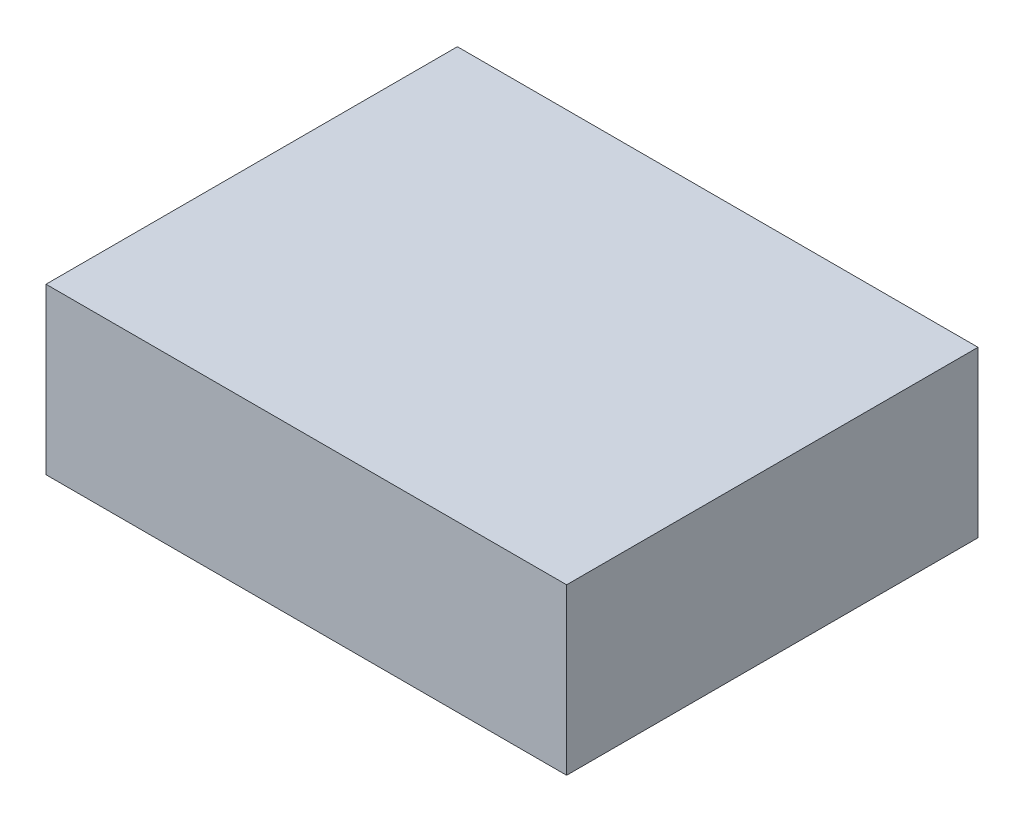
ISO-10303-21;
HEADER;
FILE_DESCRIPTION(('STEP AP214'),'2;1');
FILE_NAME('part.step','',(''),(''),'','','');
FILE_SCHEMA(('AUTOMOTIVE_DESIGN { 1 0 10303 214 1 1 1 1 }'));
ENDSEC;
DATA;
#1=APPLICATION_CONTEXT('core data for automotive mechanical design processes');
#2=APPLICATION_PROTOCOL_DEFINITION('international standard','automotive_design',2000,#1);
#3=PRODUCT_CONTEXT('',#1,'mechanical');
#4=PRODUCT('Part','Part','',(#3));
#5=PRODUCT_RELATED_PRODUCT_CATEGORY('part','',(#4));
#6=PRODUCT_DEFINITION_FORMATION('','',#4);
#7=PRODUCT_DEFINITION_CONTEXT('part definition',#1,'design');
#8=PRODUCT_DEFINITION('design','',#6,#7);
#9=PRODUCT_DEFINITION_SHAPE('','',#8);
#10=(LENGTH_UNIT() NAMED_UNIT(*) SI_UNIT(.MILLI.,.METRE.));
#11=(NAMED_UNIT(*) PLANE_ANGLE_UNIT() SI_UNIT($,.RADIAN.));
#12=(NAMED_UNIT(*) SI_UNIT($,.STERADIAN.) SOLID_ANGLE_UNIT());
#13=UNCERTAINTY_MEASURE_WITH_UNIT(LENGTH_MEASURE(1.E-05),#10,'distance_accuracy_value','');
#14=(GEOMETRIC_REPRESENTATION_CONTEXT(3) GLOBAL_UNCERTAINTY_ASSIGNED_CONTEXT((#13)) GLOBAL_UNIT_ASSIGNED_CONTEXT((#10,
#11,#12)) REPRESENTATION_CONTEXT('',''));
#15=CARTESIAN_POINT('',(0.,0.,0.));
#16=DIRECTION('',(0.,0.,1.));
#17=DIRECTION('',(1.,0.,0.));
#18=AXIS2_PLACEMENT_3D('',#15,#16,#17);
#19=CARTESIAN_POINT('',(-20.3017236594292,10.,-5.54830057876643));
#20=DIRECTION('',(1.,0.,0.));
#21=DIRECTION('',(0.,0.,-1.));
#22=AXIS2_PLACEMENT_3D('',#19,#20,#21);
#23=PLANE('',#22);
#24=DIRECTION('',(0.,0.,1.));
#25=VECTOR('',#24,1.);
#26=CARTESIAN_POINT('',(-20.3017236594292,0.,-5.54830057876643));
#27=LINE('',#26,#25);
#28=CARTESIAN_POINT('',(-20.3017236594292,0.,-5.54830057876643));
#29=VERTEX_POINT('',#28);
#30=CARTESIAN_POINT('',(-20.3017236594292,0.,19.3863795404354));
#31=VERTEX_POINT('',#30);
#32=EDGE_CURVE('E96',#29,#31,#27,.T.);
#33=ORIENTED_EDGE('',*,*,#32,.T.);
#34=DIRECTION('',(0.,-1.,0.));
#35=VECTOR('',#34,1.);
#36=CARTESIAN_POINT('',(-20.3017236594292,10.,19.3863795404354));
#37=LINE('',#36,#35);
#38=CARTESIAN_POINT('',(-20.3017236594292,10.,19.3863795404354));
#39=VERTEX_POINT('',#38);
#40=EDGE_CURVE('E11',#39,#31,#37,.T.);
#41=ORIENTED_EDGE('',*,*,#40,.F.);
#42=DIRECTION('',(0.,0.,1.));
#43=VECTOR('',#42,1.);
#44=CARTESIAN_POINT('',(-20.3017236594292,10.,-5.54830057876643));
#45=LINE('',#44,#43);
#46=CARTESIAN_POINT('',(-20.3017236594292,10.,-5.54830057876643));
#47=VERTEX_POINT('',#46);
#48=EDGE_CURVE('E84',#47,#39,#45,.T.);
#49=ORIENTED_EDGE('',*,*,#48,.F.);
#50=DIRECTION('',(0.,-1.,0.));
#51=VECTOR('',#50,1.);
#52=CARTESIAN_POINT('',(-20.3017236594292,10.,-5.54830057876643));
#53=LINE('',#52,#51);
#54=EDGE_CURVE('E92',#47,#29,#53,.T.);
#55=ORIENTED_EDGE('',*,*,#54,.T.);
#56=EDGE_LOOP('',(#33,#41,#49,#55));
#57=FACE_BOUND('',#56,.T.);
#58=ADVANCED_FACE('F33',(#57),#23,.F.);
#59=CARTESIAN_POINT('',(-20.3017236594292,10.,19.3863795404354));
#60=DIRECTION('',(0.,0.,-1.));
#61=DIRECTION('',(-1.,0.,0.));
#62=AXIS2_PLACEMENT_3D('',#59,#60,#61);
#63=PLANE('',#62);
#64=DIRECTION('',(1.,0.,0.));
#65=VECTOR('',#64,1.);
#66=CARTESIAN_POINT('',(-20.3017236594292,0.,19.3863795404354));
#67=LINE('',#66,#65);
#68=CARTESIAN_POINT('',(11.2538586194546,0.,19.3863795404354));
#69=VERTEX_POINT('',#68);
#70=EDGE_CURVE('E88',#31,#69,#67,.T.);
#71=ORIENTED_EDGE('',*,*,#70,.T.);
#72=DIRECTION('',(0.,-1.,0.));
#73=VECTOR('',#72,1.);
#74=CARTESIAN_POINT('',(11.2538586194546,10.,19.3863795404354));
#75=LINE('',#74,#73);
#76=CARTESIAN_POINT('',(11.2538586194546,10.,19.3863795404354));
#77=VERTEX_POINT('',#76);
#78=EDGE_CURVE('E41',#77,#69,#75,.T.);
#79=ORIENTED_EDGE('',*,*,#78,.F.);
#80=DIRECTION('',(1.,0.,0.));
#81=VECTOR('',#80,1.);
#82=CARTESIAN_POINT('',(-20.3017236594292,10.,19.3863795404354));
#83=LINE('',#82,#81);
#84=EDGE_CURVE('E79',#39,#77,#83,.T.);
#85=ORIENTED_EDGE('',*,*,#84,.F.);
#86=ORIENTED_EDGE('',*,*,#40,.T.);
#87=EDGE_LOOP('',(#71,#79,#85,#86));
#88=FACE_BOUND('',#87,.T.);
#89=ADVANCED_FACE('F87',(#88),#63,.F.);
#90=CARTESIAN_POINT('',(11.2538586194546,10.,-5.54830057876643));
#91=DIRECTION('',(-1.,0.,0.));
#92=DIRECTION('',(0.,0.,1.));
#93=AXIS2_PLACEMENT_3D('',#90,#91,#92);
#94=PLANE('',#93);
#95=DIRECTION('',(0.,0.,-1.));
#96=VECTOR('',#95,1.);
#97=CARTESIAN_POINT('',(11.2538586194546,0.,-5.54830057876643));
#98=LINE('',#97,#96);
#99=CARTESIAN_POINT('',(11.2538586194546,0.,-5.54830057876643));
#100=VERTEX_POINT('',#99);
#101=EDGE_CURVE('E66',#69,#100,#98,.T.);
#102=ORIENTED_EDGE('',*,*,#101,.T.);
#103=DIRECTION('',(0.,-1.,0.));
#104=VECTOR('',#103,1.);
#105=CARTESIAN_POINT('',(11.2538586194546,10.,-5.54830057876643));
#106=LINE('',#105,#104);
#107=CARTESIAN_POINT('',(11.2538586194546,10.,-5.54830057876643));
#108=VERTEX_POINT('',#107);
#109=EDGE_CURVE('E89',#108,#100,#106,.T.);
#110=ORIENTED_EDGE('',*,*,#109,.F.);
#111=DIRECTION('',(0.,0.,-1.));
#112=VECTOR('',#111,1.);
#113=CARTESIAN_POINT('',(11.2538586194546,10.,-5.54830057876643));
#114=LINE('',#113,#112);
#115=EDGE_CURVE('E82',#77,#108,#114,.T.);
#116=ORIENTED_EDGE('',*,*,#115,.F.);
#117=ORIENTED_EDGE('',*,*,#78,.T.);
#118=EDGE_LOOP('',(#102,#110,#116,#117));
#119=FACE_BOUND('',#118,.T.);
#120=ADVANCED_FACE('F90',(#119),#94,.F.);
#121=CARTESIAN_POINT('',(-20.3017236594292,10.,-5.54830057876643));
#122=DIRECTION('',(0.,0.,1.));
#123=DIRECTION('',(1.,0.,0.));
#124=AXIS2_PLACEMENT_3D('',#121,#122,#123);
#125=PLANE('',#124);
#126=DIRECTION('',(-1.,0.,0.));
#127=VECTOR('',#126,1.);
#128=CARTESIAN_POINT('',(-20.3017236594292,0.,-5.54830057876643));
#129=LINE('',#128,#127);
#130=EDGE_CURVE('E72',#100,#29,#129,.T.);
#131=ORIENTED_EDGE('',*,*,#130,.T.);
#132=ORIENTED_EDGE('',*,*,#54,.F.);
#133=DIRECTION('',(-1.,0.,0.));
#134=VECTOR('',#133,1.);
#135=CARTESIAN_POINT('',(-20.3017236594292,10.,-5.54830057876643));
#136=LINE('',#135,#134);
#137=EDGE_CURVE('E49',#108,#47,#136,.T.);
#138=ORIENTED_EDGE('',*,*,#137,.F.);
#139=ORIENTED_EDGE('',*,*,#109,.T.);
#140=EDGE_LOOP('',(#131,#132,#138,#139));
#141=FACE_BOUND('',#140,.T.);
#142=ADVANCED_FACE('F103',(#141),#125,.F.);
#143=CARTESIAN_POINT('',(0.,10.,0.));
#144=DIRECTION('',(0.,1.,0.));
#145=DIRECTION('',(0.,0.,1.));
#146=AXIS2_PLACEMENT_3D('',#143,#144,#145);
#147=PLANE('',#146);
#148=ORIENTED_EDGE('',*,*,#48,.T.);
#149=ORIENTED_EDGE('',*,*,#84,.T.);
#150=ORIENTED_EDGE('',*,*,#115,.T.);
#151=ORIENTED_EDGE('',*,*,#137,.T.);
#152=EDGE_LOOP('',(#148,#149,#150,#151));
#153=FACE_BOUND('',#152,.T.);
#154=ADVANCED_FACE('F80',(#153),#147,.T.);
#155=CARTESIAN_POINT('',(0.,0.,0.));
#156=DIRECTION('',(0.,1.,0.));
#157=DIRECTION('',(0.,0.,1.));
#158=AXIS2_PLACEMENT_3D('',#155,#156,#157);
#159=PLANE('',#158);
#160=ORIENTED_EDGE('',*,*,#32,.F.);
#161=ORIENTED_EDGE('',*,*,#130,.F.);
#162=ORIENTED_EDGE('',*,*,#101,.F.);
#163=ORIENTED_EDGE('',*,*,#70,.F.);
#164=EDGE_LOOP('',(#160,#161,#162,#163));
#165=FACE_BOUND('',#164,.T.);
#166=ADVANCED_FACE('F106',(#165),#159,.F.);
#167=CLOSED_SHELL('',(#58,#89,#120,#142,#154,#166));
#168=MANIFOLD_SOLID_BREP('B2',#167);
#169=ADVANCED_BREP_SHAPE_REPRESENTATION('',(#18,#168),#14);
#170=SHAPE_DEFINITION_REPRESENTATION(#9,#169);
ENDSEC;
END-ISO-10303-21;
